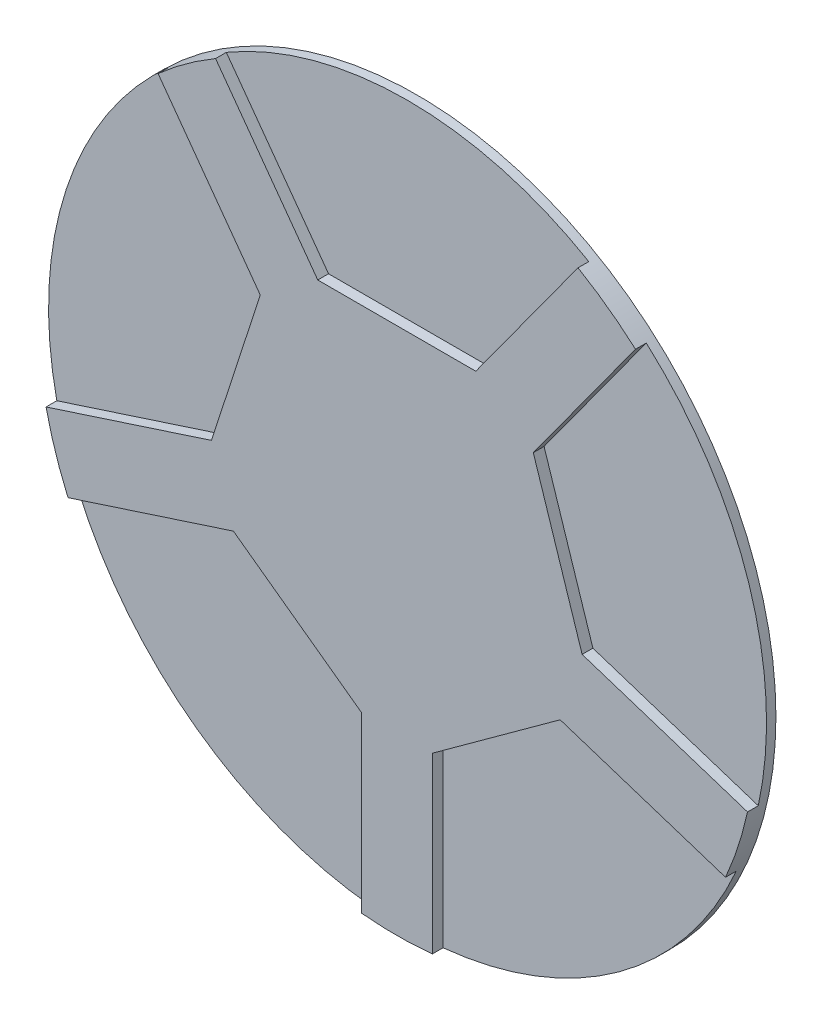
ISO-10303-21;
HEADER;
FILE_DESCRIPTION(('STEP AP214'),'2;1');
FILE_NAME('part.step','',(''),(''),'','','');
FILE_SCHEMA(('AUTOMOTIVE_DESIGN { 1 0 10303 214 1 1 1 1 }'));
ENDSEC;
DATA;
#1=APPLICATION_CONTEXT('core data for automotive mechanical design processes');
#2=APPLICATION_PROTOCOL_DEFINITION('international standard','automotive_design',2000,#1);
#3=PRODUCT_CONTEXT('',#1,'mechanical');
#4=PRODUCT('Part','Part','',(#3));
#5=PRODUCT_RELATED_PRODUCT_CATEGORY('part','',(#4));
#6=PRODUCT_DEFINITION_FORMATION('','',#4);
#7=PRODUCT_DEFINITION_CONTEXT('part definition',#1,'design');
#8=PRODUCT_DEFINITION('design','',#6,#7);
#9=PRODUCT_DEFINITION_SHAPE('','',#8);
#10=(LENGTH_UNIT() NAMED_UNIT(*) SI_UNIT(.MILLI.,.METRE.));
#11=(NAMED_UNIT(*) PLANE_ANGLE_UNIT() SI_UNIT($,.RADIAN.));
#12=(NAMED_UNIT(*) SI_UNIT($,.STERADIAN.) SOLID_ANGLE_UNIT());
#13=UNCERTAINTY_MEASURE_WITH_UNIT(LENGTH_MEASURE(1.E-05),#10,'distance_accuracy_value','');
#14=(GEOMETRIC_REPRESENTATION_CONTEXT(3) GLOBAL_UNCERTAINTY_ASSIGNED_CONTEXT((#13)) GLOBAL_UNIT_ASSIGNED_CONTEXT((#10,
#11,#12)) REPRESENTATION_CONTEXT('',''));
#15=CARTESIAN_POINT('',(0.,0.,0.));
#16=DIRECTION('',(0.,0.,1.));
#17=DIRECTION('',(1.,0.,0.));
#18=AXIS2_PLACEMENT_3D('',#15,#16,#17);
#19=CARTESIAN_POINT('',(0.,0.,12.));
#20=DIRECTION('',(0.,0.,-1.));
#21=DIRECTION('',(-1.,0.,0.));
#22=AXIS2_PLACEMENT_3D('',#19,#20,#21);
#23=CYLINDRICAL_SURFACE('',#22,213.710950614874);
#24=CARTESIAN_POINT('',(1.05588484211067E-13,0.,5.59499683127459));
#25=DIRECTION('',(0.,0.,1.));
#26=DIRECTION('',(-0.309016994374958,-0.95105651629515,0.));
#27=AXIS2_PLACEMENT_3D('',#24,#25,#26);
#28=CIRCLE('',#27,213.710950614874);
#29=CARTESIAN_POINT('',(-142.113721256613,159.612219592708,5.59499683127459));
#30=VERTEX_POINT('',#29);
#31=CARTESIAN_POINT('',(-208.790124392727,-45.5966486573619,5.59499683127459));
#32=VERTEX_POINT('',#31);
#33=EDGE_CURVE('E276',#30,#32,#28,.T.);
#34=ORIENTED_EDGE('',*,*,#33,.F.);
#35=DIRECTION('',(0.,0.,1.));
#36=VECTOR('',#35,1.);
#37=CARTESIAN_POINT('',(-142.113721256613,159.612219592708,5.59499683127459));
#38=LINE('',#37,#36);
#39=CARTESIAN_POINT('',(-142.113721256613,159.612219592708,12.));
#40=VERTEX_POINT('',#39);
#41=EDGE_CURVE('E289',#30,#40,#38,.T.);
#42=ORIENTED_EDGE('',*,*,#41,.T.);
#43=CARTESIAN_POINT('',(0.,0.,12.));
#44=DIRECTION('',(0.,0.,1.));
#45=DIRECTION('',(1.,0.,0.));
#46=AXIS2_PLACEMENT_3D('',#43,#44,#45);
#47=CIRCLE('',#46,213.710950614874);
#48=CARTESIAN_POINT('',(-107.884686521819,184.481069020109,12.));
#49=VERTEX_POINT('',#48);
#50=EDGE_CURVE('E11',#49,#40,#47,.T.);
#51=ORIENTED_EDGE('',*,*,#50,.F.);
#52=DIRECTION('',(0.,0.,1.));
#53=VECTOR('',#52,1.);
#54=CARTESIAN_POINT('',(-107.884686521819,184.481069020109,5.59499683127459));
#55=LINE('',#54,#53);
#56=CARTESIAN_POINT('',(-107.884686521819,184.481069020109,5.59499683127459));
#57=VERTEX_POINT('',#56);
#58=EDGE_CURVE('E383',#57,#49,#55,.T.);
#59=ORIENTED_EDGE('',*,*,#58,.F.);
#60=CARTESIAN_POINT('',(0.,-1.11022302462516E-13,5.59499683127459));
#61=DIRECTION('',(0.,0.,1.));
#62=DIRECTION('',(-1.,0.,0.));
#63=AXIS2_PLACEMENT_3D('',#60,#61,#62);
#64=CIRCLE('',#63,213.710950614874);
#65=CARTESIAN_POINT('',(107.884686521819,184.481069020109,5.59499683127459));
#66=VERTEX_POINT('',#65);
#67=EDGE_CURVE('E353',#66,#57,#64,.T.);
#68=ORIENTED_EDGE('',*,*,#67,.F.);
#69=DIRECTION('',(0.,0.,1.));
#70=VECTOR('',#69,1.);
#71=CARTESIAN_POINT('',(107.884686521819,184.481069020109,5.59499683127459));
#72=LINE('',#71,#70);
#73=CARTESIAN_POINT('',(107.884686521819,184.481069020109,12.));
#74=VERTEX_POINT('',#73);
#75=EDGE_CURVE('E366',#66,#74,#72,.T.);
#76=ORIENTED_EDGE('',*,*,#75,.T.);
#77=CARTESIAN_POINT('',(142.113721256615,159.612219592706,12.));
#78=VERTEX_POINT('',#77);
#79=EDGE_CURVE('E49',#78,#74,#47,.T.);
#80=ORIENTED_EDGE('',*,*,#79,.F.);
#81=DIRECTION('',(0.,0.,1.));
#82=VECTOR('',#81,1.);
#83=CARTESIAN_POINT('',(142.113721256615,159.612219592706,5.59499683127459));
#84=LINE('',#83,#82);
#85=CARTESIAN_POINT('',(142.113721256615,159.612219592706,5.59499683127459));
#86=VERTEX_POINT('',#85);
#87=EDGE_CURVE('E56',#86,#78,#84,.T.);
#88=ORIENTED_EDGE('',*,*,#87,.F.);
#89=CARTESIAN_POINT('',(-1.05588484211067E-13,0.,5.59499683127459));
#90=DIRECTION('',(0.,0.,1.));
#91=DIRECTION('',(-0.309016994374945,0.951056516295155,0.));
#92=AXIS2_PLACEMENT_3D('',#89,#90,#91);
#93=CIRCLE('',#92,213.710950614874);
#94=CARTESIAN_POINT('',(208.790124392726,-45.5966486573648,5.59499683127459));
#95=VERTEX_POINT('',#94);
#96=EDGE_CURVE('E315',#95,#86,#93,.T.);
#97=ORIENTED_EDGE('',*,*,#96,.F.);
#98=DIRECTION('',(0.,0.,1.));
#99=VECTOR('',#98,1.);
#100=CARTESIAN_POINT('',(208.790124392726,-45.5966486573648,5.59499683127459));
#101=LINE('',#100,#99);
#102=CARTESIAN_POINT('',(208.790124392726,-45.5966486573648,12.));
#103=VERTEX_POINT('',#102);
#104=EDGE_CURVE('E328',#95,#103,#101,.T.);
#105=ORIENTED_EDGE('',*,*,#104,.T.);
#106=CARTESIAN_POINT('',(195.715796526134,-85.8352922920052,12.));
#107=VERTEX_POINT('',#106);
#108=EDGE_CURVE('E407',#107,#103,#47,.T.);
#109=ORIENTED_EDGE('',*,*,#108,.F.);
#110=DIRECTION('',(0.,0.,1.));
#111=VECTOR('',#110,1.);
#112=CARTESIAN_POINT('',(195.715796526134,-85.8352922920052,5.59499683127459));
#113=LINE('',#112,#111);
#114=CARTESIAN_POINT('',(195.715796526134,-85.8352922920052,5.59499683127459));
#115=VERTEX_POINT('',#114);
#116=EDGE_CURVE('E64',#115,#107,#113,.T.);
#117=ORIENTED_EDGE('',*,*,#116,.F.);
#118=CARTESIAN_POINT('',(0.,0.,5.59499683127459));
#119=DIRECTION('',(0.,0.,1.));
#120=DIRECTION('',(0.809016994374951,0.587785252292469,0.));
#121=AXIS2_PLACEMENT_3D('',#118,#119,#120);
#122=CIRCLE('',#121,213.710950614874);
#123=CARTESIAN_POINT('',(21.1547068682035,-212.661347663447,5.59499683127459));
#124=VERTEX_POINT('',#123);
#125=EDGE_CURVE('E198',#124,#115,#122,.T.);
#126=ORIENTED_EDGE('',*,*,#125,.F.);
#127=DIRECTION('',(0.,0.,1.));
#128=VECTOR('',#127,1.);
#129=CARTESIAN_POINT('',(21.1547068682035,-212.661347663447,5.59499683127459));
#130=LINE('',#129,#128);
#131=CARTESIAN_POINT('',(21.1547068682035,-212.661347663447,12.));
#132=VERTEX_POINT('',#131);
#133=EDGE_CURVE('E180',#124,#132,#130,.T.);
#134=ORIENTED_EDGE('',*,*,#133,.T.);
#135=CARTESIAN_POINT('',(-21.1547068682066,-212.661347663447,12.));
#136=VERTEX_POINT('',#135);
#137=EDGE_CURVE('E411',#136,#132,#47,.T.);
#138=ORIENTED_EDGE('',*,*,#137,.F.);
#139=DIRECTION('',(0.,0.,1.));
#140=VECTOR('',#139,1.);
#141=CARTESIAN_POINT('',(-21.1547068682066,-212.661347663447,5.59499683127459));
#142=LINE('',#141,#140);
#143=CARTESIAN_POINT('',(-21.1547068682066,-212.661347663447,5.59499683127459));
#144=VERTEX_POINT('',#143);
#145=EDGE_CURVE('E266',#144,#136,#142,.T.);
#146=ORIENTED_EDGE('',*,*,#145,.F.);
#147=CARTESIAN_POINT('',(0.,0.,5.59499683127459));
#148=DIRECTION('',(0.,0.,1.));
#149=DIRECTION('',(0.809016994374942,-0.58778525229248,0.));
#150=AXIS2_PLACEMENT_3D('',#147,#148,#149);
#151=CIRCLE('',#150,213.710950614874);
#152=CARTESIAN_POINT('',(-195.715796526136,-85.8352922920024,5.59499683127459));
#153=VERTEX_POINT('',#152);
#154=EDGE_CURVE('E236',#153,#144,#151,.T.);
#155=ORIENTED_EDGE('',*,*,#154,.F.);
#156=DIRECTION('',(0.,0.,1.));
#157=VECTOR('',#156,1.);
#158=CARTESIAN_POINT('',(-195.715796526136,-85.8352922920024,5.59499683127459));
#159=LINE('',#158,#157);
#160=CARTESIAN_POINT('',(-195.715796526136,-85.8352922920024,12.));
#161=VERTEX_POINT('',#160);
#162=EDGE_CURVE('E249',#153,#161,#159,.T.);
#163=ORIENTED_EDGE('',*,*,#162,.T.);
#164=CARTESIAN_POINT('',(-208.790124392727,-45.5966486573619,12.));
#165=VERTEX_POINT('',#164);
#166=EDGE_CURVE('E48',#165,#161,#47,.T.);
#167=ORIENTED_EDGE('',*,*,#166,.F.);
#168=DIRECTION('',(0.,0.,1.));
#169=VECTOR('',#168,1.);
#170=CARTESIAN_POINT('',(-208.790124392727,-45.5966486573619,5.59499683127459));
#171=LINE('',#170,#169);
#172=EDGE_CURVE('E305',#32,#165,#171,.T.);
#173=ORIENTED_EDGE('',*,*,#172,.F.);
#174=EDGE_LOOP('',(#34,#42,#51,#59,#68,#76,#80,#88,#97,#105,#109,#117,#126,#134,#138,#146,#155,
#163,#167,#173));
#175=FACE_BOUND('',#174,.T.);
#176=CARTESIAN_POINT('',(0.,0.,0.));
#177=DIRECTION('',(0.,0.,1.));
#178=DIRECTION('',(1.,0.,0.));
#179=AXIS2_PLACEMENT_3D('',#176,#177,#178);
#180=CIRCLE('',#179,213.710950614874);
#181=CARTESIAN_POINT('',(213.710950614874,0.,0.));
#182=VERTEX_POINT('',#181);
#183=EDGE_CURVE('E42',#182,#182,#180,.T.);
#184=ORIENTED_EDGE('',*,*,#183,.T.);
#185=EDGE_LOOP('',(#184));
#186=FACE_BOUND('',#185,.T.);
#187=ADVANCED_FACE('F39',(#175,#186),#23,.T.);
#188=CARTESIAN_POINT('',(0.,0.,12.));
#189=DIRECTION('',(0.,0.,1.));
#190=DIRECTION('',(1.,0.,0.));
#191=AXIS2_PLACEMENT_3D('',#188,#189,#190);
#192=PLANE('',#191);
#193=DIRECTION('',(-0.587785252292466,0.809016994374953,0.));
#194=VECTOR('',#193,1.);
#195=CARTESIAN_POINT('',(-142.113721256613,159.612219592708,12.));
#196=LINE('',#195,#194);
#197=CARTESIAN_POINT('',(-81.2695769142784,75.8674393533793,12.));
#198=VERTEX_POINT('',#197);
#199=EDGE_CURVE('E290',#198,#40,#196,.T.);
#200=ORIENTED_EDGE('',*,*,#199,.F.);
#201=DIRECTION('',(0.309016994374958,0.95105651629515,0.));
#202=VECTOR('',#201,1.);
#203=CARTESIAN_POINT('',(-110.342230830423,-13.6089889863303,12.));
#204=LINE('',#203,#202);
#205=CARTESIAN_POINT('',(-110.342230830423,-13.6089889863303,12.));
#206=VERTEX_POINT('',#205);
#207=EDGE_CURVE('E277',#206,#198,#204,.T.);
#208=ORIENTED_EDGE('',*,*,#207,.F.);
#209=DIRECTION('',(0.951056516295158,0.309016994374934,0.));
#210=VECTOR('',#209,1.);
#211=CARTESIAN_POINT('',(-208.790124392727,-45.5966486573619,12.));
#212=LINE('',#211,#210);
#213=EDGE_CURVE('E293',#165,#206,#212,.T.);
#214=ORIENTED_EDGE('',*,*,#213,.F.);
#215=ORIENTED_EDGE('',*,*,#166,.T.);
#216=DIRECTION('',(-0.951056516295156,-0.309016994374941,0.));
#217=VECTOR('',#216,1.);
#218=CARTESIAN_POINT('',(-195.715796526136,-85.8352922920024,12.));
#219=LINE('',#218,#217);
#220=CARTESIAN_POINT('',(-97.2679029638326,-53.8476326209701,12.));
#221=VERTEX_POINT('',#220);
#222=EDGE_CURVE('E250',#221,#161,#219,.T.);
#223=ORIENTED_EDGE('',*,*,#222,.F.);
#224=DIRECTION('',(-0.809016994374942,0.58778525229248,0.));
#225=VECTOR('',#224,1.);
#226=CARTESIAN_POINT('',(-21.1547068682054,-109.147106526856,12.));
#227=LINE('',#226,#225);
#228=CARTESIAN_POINT('',(-21.1547068682054,-109.147106526856,12.));
#229=VERTEX_POINT('',#228);
#230=EDGE_CURVE('E237',#229,#221,#227,.T.);
#231=ORIENTED_EDGE('',*,*,#230,.F.);
#232=DIRECTION('',(0.,1.,0.));
#233=VECTOR('',#232,1.);
#234=CARTESIAN_POINT('',(-21.1547068682066,-212.661347663447,12.));
#235=LINE('',#234,#233);
#236=EDGE_CURVE('E253',#136,#229,#235,.T.);
#237=ORIENTED_EDGE('',*,*,#236,.F.);
#238=ORIENTED_EDGE('',*,*,#137,.T.);
#239=DIRECTION('',(0.,-1.,0.));
#240=VECTOR('',#239,1.);
#241=CARTESIAN_POINT('',(21.1547068682035,-212.661347663447,12.));
#242=LINE('',#241,#240);
#243=CARTESIAN_POINT('',(21.1547068682038,-109.147106526856,12.));
#244=VERTEX_POINT('',#243);
#245=EDGE_CURVE('E186',#244,#132,#242,.T.);
#246=ORIENTED_EDGE('',*,*,#245,.F.);
#247=DIRECTION('',(-0.809016994374951,-0.587785252292468,0.));
#248=VECTOR('',#247,1.);
#249=CARTESIAN_POINT('',(97.2679029638318,-53.8476326209715,12.));
#250=LINE('',#249,#248);
#251=CARTESIAN_POINT('',(97.2679029638318,-53.8476326209715,12.));
#252=VERTEX_POINT('',#251);
#253=EDGE_CURVE('E201',#252,#244,#250,.T.);
#254=ORIENTED_EDGE('',*,*,#253,.F.);
#255=DIRECTION('',(-0.951056516295151,0.309016994374955,0.));
#256=VECTOR('',#255,1.);
#257=CARTESIAN_POINT('',(195.715796526134,-85.8352922920052,12.));
#258=LINE('',#257,#256);
#259=EDGE_CURVE('E216',#107,#252,#258,.T.);
#260=ORIENTED_EDGE('',*,*,#259,.F.);
#261=ORIENTED_EDGE('',*,*,#108,.T.);
#262=DIRECTION('',(0.951056516295154,-0.309016994374948,0.));
#263=VECTOR('',#262,1.);
#264=CARTESIAN_POINT('',(208.790124392726,-45.5966486573649,12.));
#265=LINE('',#264,#263);
#266=CARTESIAN_POINT('',(110.342230830423,-13.6089889863319,12.));
#267=VERTEX_POINT('',#266);
#268=EDGE_CURVE('E226',#267,#103,#265,.T.);
#269=ORIENTED_EDGE('',*,*,#268,.F.);
#270=DIRECTION('',(0.309016994374945,-0.951056516295155,0.));
#271=VECTOR('',#270,1.);
#272=CARTESIAN_POINT('',(81.2695769142795,75.8674393533781,12.));
#273=LINE('',#272,#271);
#274=CARTESIAN_POINT('',(81.2695769142795,75.8674393533781,12.));
#275=VERTEX_POINT('',#274);
#276=EDGE_CURVE('E316',#275,#267,#273,.T.);
#277=ORIENTED_EDGE('',*,*,#276,.F.);
#278=DIRECTION('',(-0.587785252292477,-0.809016994374944,0.));
#279=VECTOR('',#278,1.);
#280=CARTESIAN_POINT('',(142.113721256615,159.612219592706,12.));
#281=LINE('',#280,#279);
#282=EDGE_CURVE('E331',#78,#275,#281,.T.);
#283=ORIENTED_EDGE('',*,*,#282,.F.);
#284=ORIENTED_EDGE('',*,*,#79,.T.);
#285=DIRECTION('',(0.587785252292471,0.809016994374949,0.));
#286=VECTOR('',#285,1.);
#287=CARTESIAN_POINT('',(107.884686521819,184.481069020109,12.));
#288=LINE('',#287,#286);
#289=CARTESIAN_POINT('',(47.0405421794837,100.73628878078,12.));
#290=VERTEX_POINT('',#289);
#291=EDGE_CURVE('E340',#290,#74,#288,.T.);
#292=ORIENTED_EDGE('',*,*,#291,.F.);
#293=DIRECTION('',(1.,0.,0.));
#294=VECTOR('',#293,1.);
#295=CARTESIAN_POINT('',(-47.0405421794837,100.73628878078,12.));
#296=LINE('',#295,#294);
#297=CARTESIAN_POINT('',(-47.0405421794837,100.73628878078,12.));
#298=VERTEX_POINT('',#297);
#299=EDGE_CURVE('E354',#298,#290,#296,.T.);
#300=ORIENTED_EDGE('',*,*,#299,.F.);
#301=DIRECTION('',(0.587785252292471,-0.809016994374949,0.));
#302=VECTOR('',#301,1.);
#303=CARTESIAN_POINT('',(-107.884686521819,184.481069020109,12.));
#304=LINE('',#303,#302);
#305=EDGE_CURVE('E370',#49,#298,#304,.T.);
#306=ORIENTED_EDGE('',*,*,#305,.F.);
#307=ORIENTED_EDGE('',*,*,#50,.T.);
#308=EDGE_LOOP('',(#200,#208,#214,#215,#223,#231,#237,#238,#246,#254,#260,#261,#269,#277,#283,
#284,#292,#300,#306,#307));
#309=FACE_BOUND('',#308,.T.);
#310=ADVANCED_FACE('F404',(#309),#192,.T.);
#311=CARTESIAN_POINT('',(0.,0.,0.));
#312=DIRECTION('',(0.,0.,1.));
#313=DIRECTION('',(1.,0.,0.));
#314=AXIS2_PLACEMENT_3D('',#311,#312,#313);
#315=PLANE('',#314);
#316=ORIENTED_EDGE('',*,*,#183,.F.);
#317=EDGE_LOOP('',(#316));
#318=FACE_BOUND('',#317,.T.);
#319=ADVANCED_FACE('F415',(#318),#315,.F.);
#320=CARTESIAN_POINT('',(107.884686521819,184.481069020109,5.59499683127459));
#321=DIRECTION('',(0.809016994374949,-0.587785252292471,0.));
#322=DIRECTION('',(0.587785252292471,0.809016994374949,0.));
#323=AXIS2_PLACEMENT_3D('',#320,#321,#322);
#324=PLANE('',#323);
#325=ORIENTED_EDGE('',*,*,#291,.T.);
#326=ORIENTED_EDGE('',*,*,#75,.F.);
#327=DIRECTION('',(0.587785252292471,0.809016994374949,0.));
#328=VECTOR('',#327,1.);
#329=CARTESIAN_POINT('',(107.884686521819,184.481069020109,5.59499683127459));
#330=LINE('',#329,#328);
#331=CARTESIAN_POINT('',(47.0405421794837,100.73628878078,5.59499683127459));
#332=VERTEX_POINT('',#331);
#333=EDGE_CURVE('E349',#332,#66,#330,.T.);
#334=ORIENTED_EDGE('',*,*,#333,.F.);
#335=DIRECTION('',(0.,0.,1.));
#336=VECTOR('',#335,1.);
#337=CARTESIAN_POINT('',(47.0405421794837,100.73628878078,5.59499683127459));
#338=LINE('',#337,#336);
#339=EDGE_CURVE('E377',#332,#290,#338,.T.);
#340=ORIENTED_EDGE('',*,*,#339,.T.);
#341=EDGE_LOOP('',(#325,#326,#334,#340));
#342=FACE_BOUND('',#341,.T.);
#343=ADVANCED_FACE('F393',(#342),#324,.F.);
#344=CARTESIAN_POINT('',(-47.0405421794837,100.73628878078,5.59499683127459));
#345=DIRECTION('',(0.,-1.,0.));
#346=DIRECTION('',(0.,0.,-1.));
#347=AXIS2_PLACEMENT_3D('',#344,#345,#346);
#348=PLANE('',#347);
#349=ORIENTED_EDGE('',*,*,#299,.T.);
#350=ORIENTED_EDGE('',*,*,#339,.F.);
#351=DIRECTION('',(1.,0.,0.));
#352=VECTOR('',#351,1.);
#353=CARTESIAN_POINT('',(-47.0405421794837,100.73628878078,5.59499683127459));
#354=LINE('',#353,#352);
#355=CARTESIAN_POINT('',(-47.0405421794837,100.73628878078,5.59499683127459));
#356=VERTEX_POINT('',#355);
#357=EDGE_CURVE('E362',#356,#332,#354,.T.);
#358=ORIENTED_EDGE('',*,*,#357,.F.);
#359=DIRECTION('',(0.,0.,1.));
#360=VECTOR('',#359,1.);
#361=CARTESIAN_POINT('',(-47.0405421794837,100.73628878078,5.59499683127459));
#362=LINE('',#361,#360);
#363=EDGE_CURVE('E380',#356,#298,#362,.T.);
#364=ORIENTED_EDGE('',*,*,#363,.T.);
#365=EDGE_LOOP('',(#349,#350,#358,#364));
#366=FACE_BOUND('',#365,.T.);
#367=ADVANCED_FACE('F399',(#366),#348,.F.);
#368=CARTESIAN_POINT('',(-107.884686521819,184.481069020109,5.59499683127459));
#369=DIRECTION('',(-0.809016994374949,-0.587785252292471,0.));
#370=DIRECTION('',(0.587785252292471,-0.809016994374949,0.));
#371=AXIS2_PLACEMENT_3D('',#368,#369,#370);
#372=PLANE('',#371);
#373=ORIENTED_EDGE('',*,*,#305,.T.);
#374=ORIENTED_EDGE('',*,*,#363,.F.);
#375=DIRECTION('',(0.587785252292471,-0.809016994374949,0.));
#376=VECTOR('',#375,1.);
#377=CARTESIAN_POINT('',(-107.884686521819,184.481069020109,5.59499683127459));
#378=LINE('',#377,#376);
#379=EDGE_CURVE('E358',#57,#356,#378,.T.);
#380=ORIENTED_EDGE('',*,*,#379,.F.);
#381=ORIENTED_EDGE('',*,*,#58,.T.);
#382=EDGE_LOOP('',(#373,#374,#380,#381));
#383=FACE_BOUND('',#382,.T.);
#384=ADVANCED_FACE('F594',(#383),#372,.F.);
#385=CARTESIAN_POINT('',(0.,-1.11022302462516E-13,5.59499683127459));
#386=DIRECTION('',(0.,0.,-1.));
#387=DIRECTION('',(-1.,0.,0.));
#388=AXIS2_PLACEMENT_3D('',#385,#386,#387);
#389=PLANE('',#388);
#390=ORIENTED_EDGE('',*,*,#333,.T.);
#391=ORIENTED_EDGE('',*,*,#67,.T.);
#392=ORIENTED_EDGE('',*,*,#379,.T.);
#393=ORIENTED_EDGE('',*,*,#357,.T.);
#394=EDGE_LOOP('',(#390,#391,#392,#393));
#395=FACE_BOUND('',#394,.T.);
#396=ADVANCED_FACE('F396',(#395),#389,.F.);
#397=CARTESIAN_POINT('',(208.790124392726,-45.5966486573649,5.59499683127459));
#398=DIRECTION('',(-0.309016994374948,-0.951056516295153,0.));
#399=DIRECTION('',(0.951056516295154,-0.309016994374948,0.));
#400=AXIS2_PLACEMENT_3D('',#397,#398,#399);
#401=PLANE('',#400);
#402=ORIENTED_EDGE('',*,*,#268,.T.);
#403=ORIENTED_EDGE('',*,*,#104,.F.);
#404=DIRECTION('',(0.951056516295154,-0.309016994374948,0.));
#405=VECTOR('',#404,1.);
#406=CARTESIAN_POINT('',(208.790124392726,-45.5966486573649,5.59499683127459));
#407=LINE('',#406,#405);
#408=CARTESIAN_POINT('',(110.342230830423,-13.6089889863319,5.59499683127459));
#409=VERTEX_POINT('',#408);
#410=EDGE_CURVE('E311',#409,#95,#407,.T.);
#411=ORIENTED_EDGE('',*,*,#410,.F.);
#412=DIRECTION('',(0.,0.,1.));
#413=VECTOR('',#412,1.);
#414=CARTESIAN_POINT('',(110.342230830423,-13.6089889863319,5.59499683127459));
#415=LINE('',#414,#413);
#416=EDGE_CURVE('E337',#409,#267,#415,.T.);
#417=ORIENTED_EDGE('',*,*,#416,.T.);
#418=EDGE_LOOP('',(#402,#403,#411,#417));
#419=FACE_BOUND('',#418,.T.);
#420=ADVANCED_FACE('F437',(#419),#401,.F.);
#421=CARTESIAN_POINT('',(81.2695769142795,75.8674393533781,5.59499683127459));
#422=DIRECTION('',(-0.951056516295154,-0.309016994374945,0.));
#423=DIRECTION('',(0.309016994374945,-0.951056516295155,0.));
#424=AXIS2_PLACEMENT_3D('',#421,#422,#423);
#425=PLANE('',#424);
#426=ORIENTED_EDGE('',*,*,#276,.T.);
#427=ORIENTED_EDGE('',*,*,#416,.F.);
#428=DIRECTION('',(0.309016994374945,-0.951056516295155,0.));
#429=VECTOR('',#428,1.);
#430=CARTESIAN_POINT('',(81.2695769142795,75.8674393533781,5.59499683127459));
#431=LINE('',#430,#429);
#432=CARTESIAN_POINT('',(81.2695769142795,75.8674393533781,5.59499683127459));
#433=VERTEX_POINT('',#432);
#434=EDGE_CURVE('E324',#433,#409,#431,.T.);
#435=ORIENTED_EDGE('',*,*,#434,.F.);
#436=DIRECTION('',(0.,0.,1.));
#437=VECTOR('',#436,1.);
#438=CARTESIAN_POINT('',(81.2695769142795,75.8674393533781,5.59499683127459));
#439=LINE('',#438,#437);
#440=EDGE_CURVE('E341',#433,#275,#439,.T.);
#441=ORIENTED_EDGE('',*,*,#440,.T.);
#442=EDGE_LOOP('',(#426,#427,#435,#441));
#443=FACE_BOUND('',#442,.T.);
#444=ADVANCED_FACE('F442',(#443),#425,.F.);
#445=CARTESIAN_POINT('',(142.113721256615,159.612219592706,5.59499683127459));
#446=DIRECTION('',(-0.809016994374944,0.587785252292477,0.));
#447=DIRECTION('',(-0.587785252292477,-0.809016994374944,0.));
#448=AXIS2_PLACEMENT_3D('',#445,#446,#447);
#449=PLANE('',#448);
#450=ORIENTED_EDGE('',*,*,#282,.T.);
#451=ORIENTED_EDGE('',*,*,#440,.F.);
#452=DIRECTION('',(-0.587785252292477,-0.809016994374944,0.));
#453=VECTOR('',#452,1.);
#454=CARTESIAN_POINT('',(142.113721256615,159.612219592706,5.59499683127459));
#455=LINE('',#454,#453);
#456=EDGE_CURVE('E320',#86,#433,#455,.T.);
#457=ORIENTED_EDGE('',*,*,#456,.F.);
#458=ORIENTED_EDGE('',*,*,#87,.T.);
#459=EDGE_LOOP('',(#450,#451,#457,#458));
#460=FACE_BOUND('',#459,.T.);
#461=ADVANCED_FACE('F454',(#460),#449,.F.);
#462=CARTESIAN_POINT('',(-1.05588484211067E-13,0.,5.59499683127459));
#463=DIRECTION('',(0.,0.,-1.));
#464=DIRECTION('',(-0.309016994374945,0.951056516295155,0.));
#465=AXIS2_PLACEMENT_3D('',#462,#463,#464);
#466=PLANE('',#465);
#467=ORIENTED_EDGE('',*,*,#410,.T.);
#468=ORIENTED_EDGE('',*,*,#96,.T.);
#469=ORIENTED_EDGE('',*,*,#456,.T.);
#470=ORIENTED_EDGE('',*,*,#434,.T.);
#471=EDGE_LOOP('',(#467,#468,#469,#470));
#472=FACE_BOUND('',#471,.T.);
#473=ADVANCED_FACE('F464',(#472),#466,.F.);
#474=CARTESIAN_POINT('',(21.1547068682035,-212.661347663447,5.59499683127459));
#475=DIRECTION('',(-1.,0.,0.));
#476=DIRECTION('',(0.,-1.,0.));
#477=AXIS2_PLACEMENT_3D('',#474,#475,#476);
#478=PLANE('',#477);
#479=ORIENTED_EDGE('',*,*,#245,.T.);
#480=ORIENTED_EDGE('',*,*,#133,.F.);
#481=DIRECTION('',(0.,-1.,0.));
#482=VECTOR('',#481,1.);
#483=CARTESIAN_POINT('',(21.1547068682035,-212.661347663447,5.59499683127459));
#484=LINE('',#483,#482);
#485=CARTESIAN_POINT('',(21.1547068682038,-109.147106526856,5.59499683127459));
#486=VERTEX_POINT('',#485);
#487=EDGE_CURVE('E183',#486,#124,#484,.T.);
#488=ORIENTED_EDGE('',*,*,#487,.F.);
#489=DIRECTION('',(0.,0.,1.));
#490=VECTOR('',#489,1.);
#491=CARTESIAN_POINT('',(21.1547068682038,-109.147106526856,5.59499683127459));
#492=LINE('',#491,#490);
#493=EDGE_CURVE('E223',#486,#244,#492,.T.);
#494=ORIENTED_EDGE('',*,*,#493,.T.);
#495=EDGE_LOOP('',(#479,#480,#488,#494));
#496=FACE_BOUND('',#495,.T.);
#497=ADVANCED_FACE('F182',(#496),#478,.F.);
#498=CARTESIAN_POINT('',(97.2679029638318,-53.8476326209715,5.59499683127459));
#499=DIRECTION('',(-0.587785252292468,0.809016994374951,0.));
#500=DIRECTION('',(-0.809016994374951,-0.587785252292468,0.));
#501=AXIS2_PLACEMENT_3D('',#498,#499,#500);
#502=PLANE('',#501);
#503=ORIENTED_EDGE('',*,*,#253,.T.);
#504=ORIENTED_EDGE('',*,*,#493,.F.);
#505=DIRECTION('',(-0.809016994374951,-0.587785252292468,0.));
#506=VECTOR('',#505,1.);
#507=CARTESIAN_POINT('',(97.2679029638318,-53.8476326209715,5.59499683127459));
#508=LINE('',#507,#506);
#509=CARTESIAN_POINT('',(97.2679029638318,-53.8476326209715,5.59499683127459));
#510=VERTEX_POINT('',#509);
#511=EDGE_CURVE('E192',#510,#486,#508,.T.);
#512=ORIENTED_EDGE('',*,*,#511,.F.);
#513=DIRECTION('',(0.,0.,1.));
#514=VECTOR('',#513,1.);
#515=CARTESIAN_POINT('',(97.2679029638318,-53.8476326209715,5.59499683127459));
#516=LINE('',#515,#514);
#517=EDGE_CURVE('E227',#510,#252,#516,.T.);
#518=ORIENTED_EDGE('',*,*,#517,.T.);
#519=EDGE_LOOP('',(#503,#504,#512,#518));
#520=FACE_BOUND('',#519,.T.);
#521=ADVANCED_FACE('F482',(#520),#502,.F.);
#522=CARTESIAN_POINT('',(195.715796526134,-85.8352922920052,5.59499683127459));
#523=DIRECTION('',(0.309016994374955,0.951056516295151,0.));
#524=DIRECTION('',(-0.951056516295151,0.309016994374955,0.));
#525=AXIS2_PLACEMENT_3D('',#522,#523,#524);
#526=PLANE('',#525);
#527=ORIENTED_EDGE('',*,*,#259,.T.);
#528=ORIENTED_EDGE('',*,*,#517,.F.);
#529=DIRECTION('',(-0.951056516295151,0.309016994374955,0.));
#530=VECTOR('',#529,1.);
#531=CARTESIAN_POINT('',(195.715796526134,-85.8352922920052,5.59499683127459));
#532=LINE('',#531,#530);
#533=EDGE_CURVE('E207',#115,#510,#532,.T.);
#534=ORIENTED_EDGE('',*,*,#533,.F.);
#535=ORIENTED_EDGE('',*,*,#116,.T.);
#536=EDGE_LOOP('',(#527,#528,#534,#535));
#537=FACE_BOUND('',#536,.T.);
#538=ADVANCED_FACE('F491',(#537),#526,.F.);
#539=CARTESIAN_POINT('',(0.,0.,5.59499683127459));
#540=DIRECTION('',(0.,0.,-1.));
#541=DIRECTION('',(0.809016994374951,0.587785252292469,0.));
#542=AXIS2_PLACEMENT_3D('',#539,#540,#541);
#543=PLANE('',#542);
#544=ORIENTED_EDGE('',*,*,#487,.T.);
#545=ORIENTED_EDGE('',*,*,#125,.T.);
#546=ORIENTED_EDGE('',*,*,#533,.T.);
#547=ORIENTED_EDGE('',*,*,#511,.T.);
#548=EDGE_LOOP('',(#544,#545,#546,#547));
#549=FACE_BOUND('',#548,.T.);
#550=ADVANCED_FACE('F196',(#549),#543,.F.);
#551=CARTESIAN_POINT('',(-195.715796526136,-85.8352922920024,5.59499683127459));
#552=DIRECTION('',(-0.309016994374941,0.951056516295156,0.));
#553=DIRECTION('',(-0.951056516295156,-0.309016994374941,0.));
#554=AXIS2_PLACEMENT_3D('',#551,#552,#553);
#555=PLANE('',#554);
#556=ORIENTED_EDGE('',*,*,#222,.T.);
#557=ORIENTED_EDGE('',*,*,#162,.F.);
#558=DIRECTION('',(-0.951056516295156,-0.309016994374941,0.));
#559=VECTOR('',#558,1.);
#560=CARTESIAN_POINT('',(-195.715796526136,-85.8352922920024,5.59499683127459));
#561=LINE('',#560,#559);
#562=CARTESIAN_POINT('',(-97.2679029638326,-53.8476326209701,5.59499683127459));
#563=VERTEX_POINT('',#562);
#564=EDGE_CURVE('E232',#563,#153,#561,.T.);
#565=ORIENTED_EDGE('',*,*,#564,.F.);
#566=DIRECTION('',(0.,0.,1.));
#567=VECTOR('',#566,1.);
#568=CARTESIAN_POINT('',(-97.2679029638326,-53.8476326209701,5.59499683127459));
#569=LINE('',#568,#567);
#570=EDGE_CURVE('E217',#563,#221,#569,.T.);
#571=ORIENTED_EDGE('',*,*,#570,.T.);
#572=EDGE_LOOP('',(#556,#557,#565,#571));
#573=FACE_BOUND('',#572,.T.);
#574=ADVANCED_FACE('F509',(#573),#555,.F.);
#575=CARTESIAN_POINT('',(-21.1547068682054,-109.147106526856,5.59499683127459));
#576=DIRECTION('',(0.58778525229248,0.809016994374942,0.));
#577=DIRECTION('',(-0.809016994374942,0.58778525229248,0.));
#578=AXIS2_PLACEMENT_3D('',#575,#576,#577);
#579=PLANE('',#578);
#580=ORIENTED_EDGE('',*,*,#230,.T.);
#581=ORIENTED_EDGE('',*,*,#570,.F.);
#582=DIRECTION('',(-0.809016994374942,0.58778525229248,0.));
#583=VECTOR('',#582,1.);
#584=CARTESIAN_POINT('',(-21.1547068682054,-109.147106526856,5.59499683127459));
#585=LINE('',#584,#583);
#586=CARTESIAN_POINT('',(-21.1547068682054,-109.147106526856,5.59499683127459));
#587=VERTEX_POINT('',#586);
#588=EDGE_CURVE('E245',#587,#563,#585,.T.);
#589=ORIENTED_EDGE('',*,*,#588,.F.);
#590=DIRECTION('',(0.,0.,1.));
#591=VECTOR('',#590,1.);
#592=CARTESIAN_POINT('',(-21.1547068682054,-109.147106526856,5.59499683127459));
#593=LINE('',#592,#591);
#594=EDGE_CURVE('E263',#587,#229,#593,.T.);
#595=ORIENTED_EDGE('',*,*,#594,.T.);
#596=EDGE_LOOP('',(#580,#581,#589,#595));
#597=FACE_BOUND('',#596,.T.);
#598=ADVANCED_FACE('F518',(#597),#579,.F.);
#599=CARTESIAN_POINT('',(-21.1547068682066,-212.661347663447,5.59499683127459));
#600=DIRECTION('',(1.,0.,0.));
#601=DIRECTION('',(0.,1.,0.));
#602=AXIS2_PLACEMENT_3D('',#599,#600,#601);
#603=PLANE('',#602);
#604=ORIENTED_EDGE('',*,*,#236,.T.);
#605=ORIENTED_EDGE('',*,*,#594,.F.);
#606=DIRECTION('',(0.,1.,0.));
#607=VECTOR('',#606,1.);
#608=CARTESIAN_POINT('',(-21.1547068682066,-212.661347663447,5.59499683127459));
#609=LINE('',#608,#607);
#610=EDGE_CURVE('E241',#144,#587,#609,.T.);
#611=ORIENTED_EDGE('',*,*,#610,.F.);
#612=ORIENTED_EDGE('',*,*,#145,.T.);
#613=EDGE_LOOP('',(#604,#605,#611,#612));
#614=FACE_BOUND('',#613,.T.);
#615=ADVANCED_FACE('F528',(#614),#603,.F.);
#616=CARTESIAN_POINT('',(0.,0.,5.59499683127459));
#617=DIRECTION('',(0.,0.,-1.));
#618=DIRECTION('',(0.809016994374942,-0.58778525229248,0.));
#619=AXIS2_PLACEMENT_3D('',#616,#617,#618);
#620=PLANE('',#619);
#621=ORIENTED_EDGE('',*,*,#564,.T.);
#622=ORIENTED_EDGE('',*,*,#154,.T.);
#623=ORIENTED_EDGE('',*,*,#610,.T.);
#624=ORIENTED_EDGE('',*,*,#588,.T.);
#625=EDGE_LOOP('',(#621,#622,#623,#624));
#626=FACE_BOUND('',#625,.T.);
#627=ADVANCED_FACE('F538',(#626),#620,.F.);
#628=CARTESIAN_POINT('',(-142.113721256613,159.612219592708,5.59499683127459));
#629=DIRECTION('',(0.809016994374953,0.587785252292466,0.));
#630=DIRECTION('',(-0.587785252292466,0.809016994374953,0.));
#631=AXIS2_PLACEMENT_3D('',#628,#629,#630);
#632=PLANE('',#631);
#633=ORIENTED_EDGE('',*,*,#199,.T.);
#634=ORIENTED_EDGE('',*,*,#41,.F.);
#635=DIRECTION('',(-0.587785252292466,0.809016994374953,0.));
#636=VECTOR('',#635,1.);
#637=CARTESIAN_POINT('',(-142.113721256613,159.612219592708,5.59499683127459));
#638=LINE('',#637,#636);
#639=CARTESIAN_POINT('',(-81.2695769142784,75.8674393533793,5.59499683127459));
#640=VERTEX_POINT('',#639);
#641=EDGE_CURVE('E272',#640,#30,#638,.T.);
#642=ORIENTED_EDGE('',*,*,#641,.F.);
#643=DIRECTION('',(0.,0.,1.));
#644=VECTOR('',#643,1.);
#645=CARTESIAN_POINT('',(-81.2695769142784,75.8674393533793,5.59499683127459));
#646=LINE('',#645,#644);
#647=EDGE_CURVE('E254',#640,#198,#646,.T.);
#648=ORIENTED_EDGE('',*,*,#647,.T.);
#649=EDGE_LOOP('',(#633,#634,#642,#648));
#650=FACE_BOUND('',#649,.T.);
#651=ADVANCED_FACE('F548',(#650),#632,.F.);
#652=CARTESIAN_POINT('',(-110.342230830423,-13.6089889863303,5.59499683127459));
#653=DIRECTION('',(0.95105651629515,-0.309016994374958,0.));
#654=DIRECTION('',(0.309016994374958,0.95105651629515,0.));
#655=AXIS2_PLACEMENT_3D('',#652,#653,#654);
#656=PLANE('',#655);
#657=ORIENTED_EDGE('',*,*,#207,.T.);
#658=ORIENTED_EDGE('',*,*,#647,.F.);
#659=DIRECTION('',(0.309016994374958,0.95105651629515,0.));
#660=VECTOR('',#659,1.);
#661=CARTESIAN_POINT('',(-110.342230830423,-13.6089889863303,5.59499683127459));
#662=LINE('',#661,#660);
#663=CARTESIAN_POINT('',(-110.342230830423,-13.6089889863303,5.59499683127459));
#664=VERTEX_POINT('',#663);
#665=EDGE_CURVE('E285',#664,#640,#662,.T.);
#666=ORIENTED_EDGE('',*,*,#665,.F.);
#667=DIRECTION('',(0.,0.,1.));
#668=VECTOR('',#667,1.);
#669=CARTESIAN_POINT('',(-110.342230830423,-13.6089889863303,5.59499683127459));
#670=LINE('',#669,#668);
#671=EDGE_CURVE('E302',#664,#206,#670,.T.);
#672=ORIENTED_EDGE('',*,*,#671,.T.);
#673=EDGE_LOOP('',(#657,#658,#666,#672));
#674=FACE_BOUND('',#673,.T.);
#675=ADVANCED_FACE('F558',(#674),#656,.F.);
#676=CARTESIAN_POINT('',(-208.790124392727,-45.5966486573619,5.59499683127459));
#677=DIRECTION('',(0.309016994374934,-0.951056516295158,0.));
#678=DIRECTION('',(0.951056516295158,0.309016994374935,0.));
#679=AXIS2_PLACEMENT_3D('',#676,#677,#678);
#680=PLANE('',#679);
#681=ORIENTED_EDGE('',*,*,#213,.T.);
#682=ORIENTED_EDGE('',*,*,#671,.F.);
#683=DIRECTION('',(0.951056516295158,0.309016994374934,0.));
#684=VECTOR('',#683,1.);
#685=CARTESIAN_POINT('',(-208.790124392727,-45.5966486573619,5.59499683127459));
#686=LINE('',#685,#684);
#687=EDGE_CURVE('E281',#32,#664,#686,.T.);
#688=ORIENTED_EDGE('',*,*,#687,.F.);
#689=ORIENTED_EDGE('',*,*,#172,.T.);
#690=EDGE_LOOP('',(#681,#682,#688,#689));
#691=FACE_BOUND('',#690,.T.);
#692=ADVANCED_FACE('F568',(#691),#680,.F.);
#693=CARTESIAN_POINT('',(1.05588484211067E-13,0.,5.59499683127459));
#694=DIRECTION('',(0.,0.,-1.));
#695=DIRECTION('',(-0.309016994374958,-0.95105651629515,0.));
#696=AXIS2_PLACEMENT_3D('',#693,#694,#695);
#697=PLANE('',#696);
#698=ORIENTED_EDGE('',*,*,#641,.T.);
#699=ORIENTED_EDGE('',*,*,#33,.T.);
#700=ORIENTED_EDGE('',*,*,#687,.T.);
#701=ORIENTED_EDGE('',*,*,#665,.T.);
#702=EDGE_LOOP('',(#698,#699,#700,#701));
#703=FACE_BOUND('',#702,.T.);
#704=ADVANCED_FACE('F578',(#703),#697,.F.);
#705=CLOSED_SHELL('',(#187,#310,#319,#343,#367,#384,#396,#420,#444,#461,#473,#497,#521,#538,
#550,#574,#598,#615,#627,#651,#675,#692,#704));
#706=MANIFOLD_SOLID_BREP('B2',#705);
#707=ADVANCED_BREP_SHAPE_REPRESENTATION('',(#18,#706),#14);
#708=SHAPE_DEFINITION_REPRESENTATION(#9,#707);
ENDSEC;
END-ISO-10303-21;
